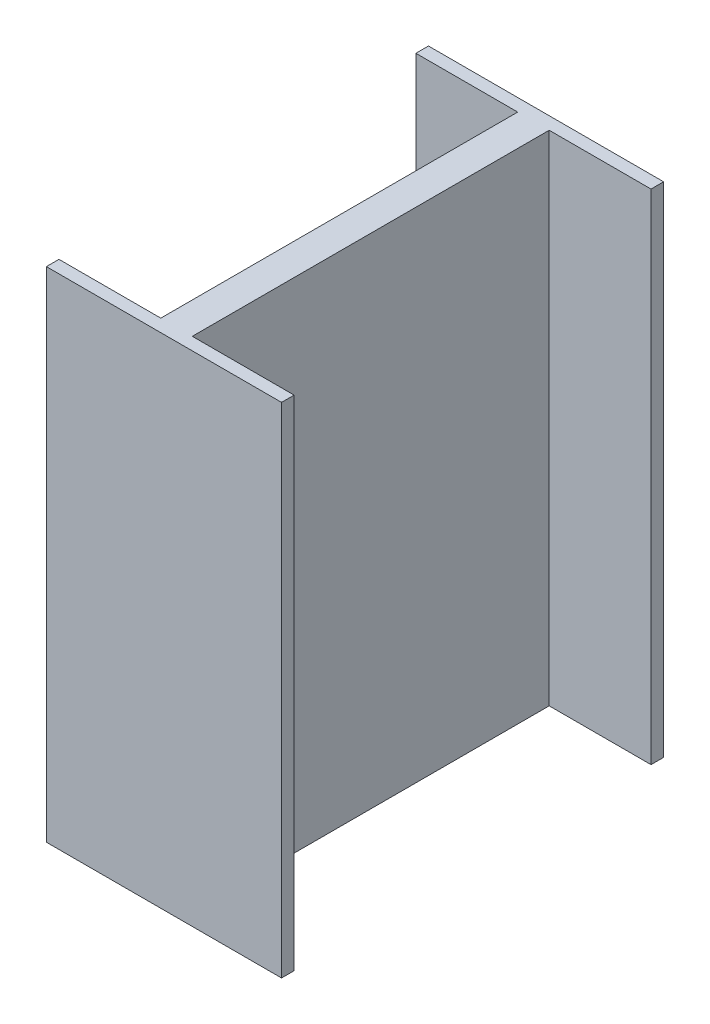
ISO-10303-21;
HEADER;
FILE_DESCRIPTION(('STEP AP214'),'2;1');
FILE_NAME('part.step','',(''),(''),'','','');
FILE_SCHEMA(('AUTOMOTIVE_DESIGN { 1 0 10303 214 1 1 1 1 }'));
ENDSEC;
DATA;
#1=APPLICATION_CONTEXT('core data for automotive mechanical design processes');
#2=APPLICATION_PROTOCOL_DEFINITION('international standard','automotive_design',2000,#1);
#3=PRODUCT_CONTEXT('',#1,'mechanical');
#4=PRODUCT('Part','Part','',(#3));
#5=PRODUCT_RELATED_PRODUCT_CATEGORY('part','',(#4));
#6=PRODUCT_DEFINITION_FORMATION('','',#4);
#7=PRODUCT_DEFINITION_CONTEXT('part definition',#1,'design');
#8=PRODUCT_DEFINITION('design','',#6,#7);
#9=PRODUCT_DEFINITION_SHAPE('','',#8);
#10=(LENGTH_UNIT() NAMED_UNIT(*) SI_UNIT(.MILLI.,.METRE.));
#11=(NAMED_UNIT(*) PLANE_ANGLE_UNIT() SI_UNIT($,.RADIAN.));
#12=(NAMED_UNIT(*) SI_UNIT($,.STERADIAN.) SOLID_ANGLE_UNIT());
#13=UNCERTAINTY_MEASURE_WITH_UNIT(LENGTH_MEASURE(1.E-05),#10,'distance_accuracy_value','');
#14=(GEOMETRIC_REPRESENTATION_CONTEXT(3) GLOBAL_UNCERTAINTY_ASSIGNED_CONTEXT((#13)) GLOBAL_UNIT_ASSIGNED_CONTEXT((#10,
#11,#12)) REPRESENTATION_CONTEXT('',''));
#15=CARTESIAN_POINT('',(0.,0.,0.));
#16=DIRECTION('',(0.,0.,1.));
#17=DIRECTION('',(1.,0.,0.));
#18=AXIS2_PLACEMENT_3D('',#15,#16,#17);
#19=CARTESIAN_POINT('',(-37.5,1187.25,-425.));
#20=DIRECTION('',(0.,0.,1.));
#21=DIRECTION('',(1.,0.,0.));
#22=AXIS2_PLACEMENT_3D('',#19,#20,#21);
#23=PLANE('',#22);
#24=DIRECTION('',(-1.,0.,0.));
#25=VECTOR('',#24,1.);
#26=CARTESIAN_POINT('',(-37.5,0.,-425.));
#27=LINE('',#26,#25);
#28=CARTESIAN_POINT('',(-37.5,0.,-425.));
#29=VERTEX_POINT('',#28);
#30=CARTESIAN_POINT('',(-280.014880556969,0.,-425.));
#31=VERTEX_POINT('',#30);
#32=EDGE_CURVE('E163',#29,#31,#27,.T.);
#33=ORIENTED_EDGE('',*,*,#32,.F.);
#34=DIRECTION('',(0.,-1.,0.));
#35=VECTOR('',#34,1.);
#36=CARTESIAN_POINT('',(-37.5,1187.25,-425.));
#37=LINE('',#36,#35);
#38=CARTESIAN_POINT('',(-37.5,1187.25,-425.));
#39=VERTEX_POINT('',#38);
#40=EDGE_CURVE('E11',#39,#29,#37,.T.);
#41=ORIENTED_EDGE('',*,*,#40,.F.);
#42=DIRECTION('',(-1.,0.,0.));
#43=VECTOR('',#42,1.);
#44=CARTESIAN_POINT('',(-37.5,1187.25,-425.));
#45=LINE('',#44,#43);
#46=CARTESIAN_POINT('',(-280.014880556969,1187.25,-425.));
#47=VERTEX_POINT('',#46);
#48=EDGE_CURVE('E193',#39,#47,#45,.T.);
#49=ORIENTED_EDGE('',*,*,#48,.T.);
#50=DIRECTION('',(0.,-1.,0.));
#51=VECTOR('',#50,1.);
#52=CARTESIAN_POINT('',(-280.014880556969,1187.25,-425.));
#53=LINE('',#52,#51);
#54=EDGE_CURVE('E45',#47,#31,#53,.T.);
#55=ORIENTED_EDGE('',*,*,#54,.T.);
#56=EDGE_LOOP('',(#33,#41,#49,#55));
#57=FACE_BOUND('',#56,.T.);
#58=ADVANCED_FACE('F42',(#57),#23,.T.);
#59=CARTESIAN_POINT('',(-37.5,1187.25,-425.));
#60=DIRECTION('',(1.,0.,0.));
#61=DIRECTION('',(0.,0.,-1.));
#62=AXIS2_PLACEMENT_3D('',#59,#60,#61);
#63=PLANE('',#62);
#64=DIRECTION('',(0.,0.,1.));
#65=VECTOR('',#64,1.);
#66=CARTESIAN_POINT('',(-37.5,0.,-425.));
#67=LINE('',#66,#65);
#68=CARTESIAN_POINT('',(-37.4999999999996,0.,425.));
#69=VERTEX_POINT('',#68);
#70=EDGE_CURVE('E99',#29,#69,#67,.T.);
#71=ORIENTED_EDGE('',*,*,#70,.T.);
#72=DIRECTION('',(0.,-1.,0.));
#73=VECTOR('',#72,1.);
#74=CARTESIAN_POINT('',(-37.4999999999996,1187.25,425.));
#75=LINE('',#74,#73);
#76=CARTESIAN_POINT('',(-37.4999999999996,1187.25,425.));
#77=VERTEX_POINT('',#76);
#78=EDGE_CURVE('E51',#77,#69,#75,.T.);
#79=ORIENTED_EDGE('',*,*,#78,.F.);
#80=DIRECTION('',(0.,0.,1.));
#81=VECTOR('',#80,1.);
#82=CARTESIAN_POINT('',(-37.5,1187.25,-425.));
#83=LINE('',#82,#81);
#84=EDGE_CURVE('E141',#39,#77,#83,.T.);
#85=ORIENTED_EDGE('',*,*,#84,.F.);
#86=ORIENTED_EDGE('',*,*,#40,.T.);
#87=EDGE_LOOP('',(#71,#79,#85,#86));
#88=FACE_BOUND('',#87,.T.);
#89=ADVANCED_FACE('F269',(#88),#63,.F.);
#90=CARTESIAN_POINT('',(-37.4999999999996,1187.25,425.));
#91=DIRECTION('',(0.,0.,1.));
#92=DIRECTION('',(1.,0.,0.));
#93=AXIS2_PLACEMENT_3D('',#90,#91,#92);
#94=PLANE('',#93);
#95=DIRECTION('',(-1.,0.,0.));
#96=VECTOR('',#95,1.);
#97=CARTESIAN_POINT('',(-37.4999999999996,0.,425.));
#98=LINE('',#97,#96);
#99=CARTESIAN_POINT('',(-280.014880556968,0.,425.));
#100=VERTEX_POINT('',#99);
#101=EDGE_CURVE('E148',#69,#100,#98,.T.);
#102=ORIENTED_EDGE('',*,*,#101,.T.);
#103=DIRECTION('',(0.,-1.,0.));
#104=VECTOR('',#103,1.);
#105=CARTESIAN_POINT('',(-280.014880556968,1187.25,425.));
#106=LINE('',#105,#104);
#107=CARTESIAN_POINT('',(-280.014880556968,1187.25,425.));
#108=VERTEX_POINT('',#107);
#109=EDGE_CURVE('E145',#108,#100,#106,.T.);
#110=ORIENTED_EDGE('',*,*,#109,.F.);
#111=DIRECTION('',(-1.,0.,0.));
#112=VECTOR('',#111,1.);
#113=CARTESIAN_POINT('',(-37.4999999999996,1187.25,425.));
#114=LINE('',#113,#112);
#115=EDGE_CURVE('E136',#77,#108,#114,.T.);
#116=ORIENTED_EDGE('',*,*,#115,.F.);
#117=ORIENTED_EDGE('',*,*,#78,.T.);
#118=EDGE_LOOP('',(#102,#110,#116,#117));
#119=FACE_BOUND('',#118,.T.);
#120=ADVANCED_FACE('F146',(#119),#94,.F.);
#121=CARTESIAN_POINT('',(-280.014880556966,1187.25,455.));
#122=DIRECTION('',(-1.,0.,0.));
#123=DIRECTION('',(0.,0.,1.));
#124=AXIS2_PLACEMENT_3D('',#121,#122,#123);
#125=PLANE('',#124);
#126=DIRECTION('',(0.,0.,-1.));
#127=VECTOR('',#126,1.);
#128=CARTESIAN_POINT('',(-280.014880556966,0.,455.));
#129=LINE('',#128,#127);
#130=CARTESIAN_POINT('',(-280.014880556966,0.,455.));
#131=VERTEX_POINT('',#130);
#132=EDGE_CURVE('E190',#131,#100,#129,.T.);
#133=ORIENTED_EDGE('',*,*,#132,.F.);
#134=DIRECTION('',(0.,-1.,0.));
#135=VECTOR('',#134,1.);
#136=CARTESIAN_POINT('',(-280.014880556966,1187.25,455.));
#137=LINE('',#136,#135);
#138=CARTESIAN_POINT('',(-280.014880556966,1187.25,455.));
#139=VERTEX_POINT('',#138);
#140=EDGE_CURVE('E152',#139,#131,#137,.T.);
#141=ORIENTED_EDGE('',*,*,#140,.F.);
#142=DIRECTION('',(0.,0.,-1.));
#143=VECTOR('',#142,1.);
#144=CARTESIAN_POINT('',(-280.014880556966,1187.25,455.));
#145=LINE('',#144,#143);
#146=EDGE_CURVE('E140',#139,#108,#145,.T.);
#147=ORIENTED_EDGE('',*,*,#146,.T.);
#148=ORIENTED_EDGE('',*,*,#109,.T.);
#149=EDGE_LOOP('',(#133,#141,#147,#148));
#150=FACE_BOUND('',#149,.T.);
#151=ADVANCED_FACE('F155',(#150),#125,.T.);
#152=CARTESIAN_POINT('',(-37.5,1187.25,455.));
#153=DIRECTION('',(0.,0.,1.));
#154=DIRECTION('',(1.,0.,0.));
#155=AXIS2_PLACEMENT_3D('',#152,#153,#154);
#156=PLANE('',#155);
#157=DIRECTION('',(-1.,0.,0.));
#158=VECTOR('',#157,1.);
#159=CARTESIAN_POINT('',(-37.5,0.,455.));
#160=LINE('',#159,#158);
#161=CARTESIAN_POINT('',(280.014880556966,0.,455.));
#162=VERTEX_POINT('',#161);
#163=EDGE_CURVE('E187',#162,#131,#160,.T.);
#164=ORIENTED_EDGE('',*,*,#163,.F.);
#165=DIRECTION('',(0.,-1.,0.));
#166=VECTOR('',#165,1.);
#167=CARTESIAN_POINT('',(280.014880556966,1187.25,455.));
#168=LINE('',#167,#166);
#169=CARTESIAN_POINT('',(280.014880556966,1187.25,455.));
#170=VERTEX_POINT('',#169);
#171=EDGE_CURVE('E197',#170,#162,#168,.T.);
#172=ORIENTED_EDGE('',*,*,#171,.F.);
#173=DIRECTION('',(1.,0.,0.));
#174=VECTOR('',#173,1.);
#175=CARTESIAN_POINT('',(37.5,1187.25,455.));
#176=LINE('',#175,#174);
#177=EDGE_CURVE('E156',#139,#170,#176,.T.);
#178=ORIENTED_EDGE('',*,*,#177,.F.);
#179=ORIENTED_EDGE('',*,*,#140,.T.);
#180=EDGE_LOOP('',(#164,#172,#178,#179));
#181=FACE_BOUND('',#180,.T.);
#182=ADVANCED_FACE('F220',(#181),#156,.T.);
#183=CARTESIAN_POINT('',(280.014880556966,1187.25,455.));
#184=DIRECTION('',(-1.,0.,0.));
#185=DIRECTION('',(0.,0.,1.));
#186=AXIS2_PLACEMENT_3D('',#183,#184,#185);
#187=PLANE('',#186);
#188=DIRECTION('',(0.,0.,-1.));
#189=VECTOR('',#188,1.);
#190=CARTESIAN_POINT('',(280.014880556966,0.,455.));
#191=LINE('',#190,#189);
#192=CARTESIAN_POINT('',(280.014880556968,0.,425.));
#193=VERTEX_POINT('',#192);
#194=EDGE_CURVE('E184',#162,#193,#191,.T.);
#195=ORIENTED_EDGE('',*,*,#194,.T.);
#196=DIRECTION('',(0.,-1.,0.));
#197=VECTOR('',#196,1.);
#198=CARTESIAN_POINT('',(280.014880556968,1187.25,425.));
#199=LINE('',#198,#197);
#200=CARTESIAN_POINT('',(280.014880556968,1187.25,425.));
#201=VERTEX_POINT('',#200);
#202=EDGE_CURVE('E200',#201,#193,#199,.T.);
#203=ORIENTED_EDGE('',*,*,#202,.F.);
#204=DIRECTION('',(0.,0.,-1.));
#205=VECTOR('',#204,1.);
#206=CARTESIAN_POINT('',(280.014880556966,1187.25,455.));
#207=LINE('',#206,#205);
#208=EDGE_CURVE('E158',#170,#201,#207,.T.);
#209=ORIENTED_EDGE('',*,*,#208,.F.);
#210=ORIENTED_EDGE('',*,*,#171,.T.);
#211=EDGE_LOOP('',(#195,#203,#209,#210));
#212=FACE_BOUND('',#211,.T.);
#213=ADVANCED_FACE('F223',(#212),#187,.F.);
#214=CARTESIAN_POINT('',(37.4999999999996,1187.25,425.));
#215=DIRECTION('',(0.,0.,-1.));
#216=DIRECTION('',(-1.,0.,0.));
#217=AXIS2_PLACEMENT_3D('',#214,#215,#216);
#218=PLANE('',#217);
#219=DIRECTION('',(1.,0.,0.));
#220=VECTOR('',#219,1.);
#221=CARTESIAN_POINT('',(37.4999999999996,0.,425.));
#222=LINE('',#221,#220);
#223=CARTESIAN_POINT('',(37.4999999999996,0.,425.));
#224=VERTEX_POINT('',#223);
#225=EDGE_CURVE('E181',#224,#193,#222,.T.);
#226=ORIENTED_EDGE('',*,*,#225,.F.);
#227=DIRECTION('',(0.,-1.,0.));
#228=VECTOR('',#227,1.);
#229=CARTESIAN_POINT('',(37.4999999999996,1187.25,425.));
#230=LINE('',#229,#228);
#231=CARTESIAN_POINT('',(37.4999999999996,1187.25,425.));
#232=VERTEX_POINT('',#231);
#233=EDGE_CURVE('E202',#232,#224,#230,.T.);
#234=ORIENTED_EDGE('',*,*,#233,.F.);
#235=DIRECTION('',(1.,0.,0.));
#236=VECTOR('',#235,1.);
#237=CARTESIAN_POINT('',(37.4999999999996,1187.25,425.));
#238=LINE('',#237,#236);
#239=EDGE_CURVE('E227',#232,#201,#238,.T.);
#240=ORIENTED_EDGE('',*,*,#239,.T.);
#241=ORIENTED_EDGE('',*,*,#202,.T.);
#242=EDGE_LOOP('',(#226,#234,#240,#241));
#243=FACE_BOUND('',#242,.T.);
#244=ADVANCED_FACE('F259',(#243),#218,.T.);
#245=CARTESIAN_POINT('',(37.5,1187.25,-425.));
#246=DIRECTION('',(1.,0.,0.));
#247=DIRECTION('',(0.,0.,-1.));
#248=AXIS2_PLACEMENT_3D('',#245,#246,#247);
#249=PLANE('',#248);
#250=DIRECTION('',(0.,0.,1.));
#251=VECTOR('',#250,1.);
#252=CARTESIAN_POINT('',(37.5,0.,-425.));
#253=LINE('',#252,#251);
#254=CARTESIAN_POINT('',(37.5,0.,-425.));
#255=VERTEX_POINT('',#254);
#256=EDGE_CURVE('E178',#255,#224,#253,.T.);
#257=ORIENTED_EDGE('',*,*,#256,.F.);
#258=DIRECTION('',(0.,-1.,0.));
#259=VECTOR('',#258,1.);
#260=CARTESIAN_POINT('',(37.5,1187.25,-425.));
#261=LINE('',#260,#259);
#262=CARTESIAN_POINT('',(37.5,1187.25,-425.));
#263=VERTEX_POINT('',#262);
#264=EDGE_CURVE('E204',#263,#255,#261,.T.);
#265=ORIENTED_EDGE('',*,*,#264,.F.);
#266=DIRECTION('',(0.,0.,1.));
#267=VECTOR('',#266,1.);
#268=CARTESIAN_POINT('',(37.5,1187.25,-425.));
#269=LINE('',#268,#267);
#270=EDGE_CURVE('E228',#263,#232,#269,.T.);
#271=ORIENTED_EDGE('',*,*,#270,.T.);
#272=ORIENTED_EDGE('',*,*,#233,.T.);
#273=EDGE_LOOP('',(#257,#265,#271,#272));
#274=FACE_BOUND('',#273,.T.);
#275=ADVANCED_FACE('F256',(#274),#249,.T.);
#276=CARTESIAN_POINT('',(37.5,1187.25,-425.));
#277=DIRECTION('',(0.,0.,-1.));
#278=DIRECTION('',(-1.,0.,0.));
#279=AXIS2_PLACEMENT_3D('',#276,#277,#278);
#280=PLANE('',#279);
#281=DIRECTION('',(1.,0.,0.));
#282=VECTOR('',#281,1.);
#283=CARTESIAN_POINT('',(37.5,0.,-425.));
#284=LINE('',#283,#282);
#285=CARTESIAN_POINT('',(280.014880556969,0.,-425.));
#286=VERTEX_POINT('',#285);
#287=EDGE_CURVE('E175',#255,#286,#284,.T.);
#288=ORIENTED_EDGE('',*,*,#287,.T.);
#289=DIRECTION('',(0.,-1.,0.));
#290=VECTOR('',#289,1.);
#291=CARTESIAN_POINT('',(280.014880556969,1187.25,-425.));
#292=LINE('',#291,#290);
#293=CARTESIAN_POINT('',(280.014880556969,1187.25,-425.));
#294=VERTEX_POINT('',#293);
#295=EDGE_CURVE('E206',#294,#286,#292,.T.);
#296=ORIENTED_EDGE('',*,*,#295,.F.);
#297=DIRECTION('',(1.,0.,0.));
#298=VECTOR('',#297,1.);
#299=CARTESIAN_POINT('',(37.5,1187.25,-425.));
#300=LINE('',#299,#298);
#301=EDGE_CURVE('E233',#263,#294,#300,.T.);
#302=ORIENTED_EDGE('',*,*,#301,.F.);
#303=ORIENTED_EDGE('',*,*,#264,.T.);
#304=EDGE_LOOP('',(#288,#296,#302,#303));
#305=FACE_BOUND('',#304,.T.);
#306=ADVANCED_FACE('F253',(#305),#280,.F.);
#307=CARTESIAN_POINT('',(280.014880556966,1187.25,-455.));
#308=DIRECTION('',(1.,0.,0.));
#309=DIRECTION('',(0.,0.,-1.));
#310=AXIS2_PLACEMENT_3D('',#307,#308,#309);
#311=PLANE('',#310);
#312=DIRECTION('',(0.,0.,1.));
#313=VECTOR('',#312,1.);
#314=CARTESIAN_POINT('',(280.014880556966,0.,-455.));
#315=LINE('',#314,#313);
#316=CARTESIAN_POINT('',(280.014880556966,0.,-455.));
#317=VERTEX_POINT('',#316);
#318=EDGE_CURVE('E172',#317,#286,#315,.T.);
#319=ORIENTED_EDGE('',*,*,#318,.F.);
#320=DIRECTION('',(0.,-1.,0.));
#321=VECTOR('',#320,1.);
#322=CARTESIAN_POINT('',(280.014880556966,1187.25,-455.));
#323=LINE('',#322,#321);
#324=CARTESIAN_POINT('',(280.014880556966,1187.25,-455.));
#325=VERTEX_POINT('',#324);
#326=EDGE_CURVE('E208',#325,#317,#323,.T.);
#327=ORIENTED_EDGE('',*,*,#326,.F.);
#328=DIRECTION('',(0.,0.,1.));
#329=VECTOR('',#328,1.);
#330=CARTESIAN_POINT('',(280.014880556966,1187.25,-455.));
#331=LINE('',#330,#329);
#332=EDGE_CURVE('E235',#325,#294,#331,.T.);
#333=ORIENTED_EDGE('',*,*,#332,.T.);
#334=ORIENTED_EDGE('',*,*,#295,.T.);
#335=EDGE_LOOP('',(#319,#327,#333,#334));
#336=FACE_BOUND('',#335,.T.);
#337=ADVANCED_FACE('F249',(#336),#311,.T.);
#338=CARTESIAN_POINT('',(37.5,1187.25,-455.));
#339=DIRECTION('',(0.,0.,-1.));
#340=DIRECTION('',(-1.,0.,0.));
#341=AXIS2_PLACEMENT_3D('',#338,#339,#340);
#342=PLANE('',#341);
#343=DIRECTION('',(1.,0.,0.));
#344=VECTOR('',#343,1.);
#345=CARTESIAN_POINT('',(37.5,0.,-455.));
#346=LINE('',#345,#344);
#347=CARTESIAN_POINT('',(-280.014880556966,0.,-455.));
#348=VERTEX_POINT('',#347);
#349=EDGE_CURVE('E169',#348,#317,#346,.T.);
#350=ORIENTED_EDGE('',*,*,#349,.F.);
#351=DIRECTION('',(0.,-1.,0.));
#352=VECTOR('',#351,1.);
#353=CARTESIAN_POINT('',(-280.014880556966,1187.25,-455.));
#354=LINE('',#353,#352);
#355=CARTESIAN_POINT('',(-280.014880556966,1187.25,-455.));
#356=VERTEX_POINT('',#355);
#357=EDGE_CURVE('E209',#356,#348,#354,.T.);
#358=ORIENTED_EDGE('',*,*,#357,.F.);
#359=DIRECTION('',(-1.,0.,0.));
#360=VECTOR('',#359,1.);
#361=CARTESIAN_POINT('',(-37.5,1187.25,-455.));
#362=LINE('',#361,#360);
#363=EDGE_CURVE('E238',#325,#356,#362,.T.);
#364=ORIENTED_EDGE('',*,*,#363,.F.);
#365=ORIENTED_EDGE('',*,*,#326,.T.);
#366=EDGE_LOOP('',(#350,#358,#364,#365));
#367=FACE_BOUND('',#366,.T.);
#368=ADVANCED_FACE('F244',(#367),#342,.T.);
#369=CARTESIAN_POINT('',(-280.014880556966,1187.25,-455.));
#370=DIRECTION('',(1.,0.,0.));
#371=DIRECTION('',(0.,0.,-1.));
#372=AXIS2_PLACEMENT_3D('',#369,#370,#371);
#373=PLANE('',#372);
#374=DIRECTION('',(0.,0.,1.));
#375=VECTOR('',#374,1.);
#376=CARTESIAN_POINT('',(-280.014880556966,0.,-455.));
#377=LINE('',#376,#375);
#378=EDGE_CURVE('E166',#348,#31,#377,.T.);
#379=ORIENTED_EDGE('',*,*,#378,.T.);
#380=ORIENTED_EDGE('',*,*,#54,.F.);
#381=DIRECTION('',(0.,0.,1.));
#382=VECTOR('',#381,1.);
#383=CARTESIAN_POINT('',(-280.014880556966,1187.25,-455.));
#384=LINE('',#383,#382);
#385=EDGE_CURVE('E109',#356,#47,#384,.T.);
#386=ORIENTED_EDGE('',*,*,#385,.F.);
#387=ORIENTED_EDGE('',*,*,#357,.T.);
#388=EDGE_LOOP('',(#379,#380,#386,#387));
#389=FACE_BOUND('',#388,.T.);
#390=ADVANCED_FACE('F214',(#389),#373,.F.);
#391=CARTESIAN_POINT('',(0.,1187.25,0.));
#392=DIRECTION('',(0.,1.,0.));
#393=DIRECTION('',(0.,0.,1.));
#394=AXIS2_PLACEMENT_3D('',#391,#392,#393);
#395=PLANE('',#394);
#396=ORIENTED_EDGE('',*,*,#48,.F.);
#397=ORIENTED_EDGE('',*,*,#84,.T.);
#398=ORIENTED_EDGE('',*,*,#115,.T.);
#399=ORIENTED_EDGE('',*,*,#146,.F.);
#400=ORIENTED_EDGE('',*,*,#177,.T.);
#401=ORIENTED_EDGE('',*,*,#208,.T.);
#402=ORIENTED_EDGE('',*,*,#239,.F.);
#403=ORIENTED_EDGE('',*,*,#270,.F.);
#404=ORIENTED_EDGE('',*,*,#301,.T.);
#405=ORIENTED_EDGE('',*,*,#332,.F.);
#406=ORIENTED_EDGE('',*,*,#363,.T.);
#407=ORIENTED_EDGE('',*,*,#385,.T.);
#408=EDGE_LOOP('',(#396,#397,#398,#399,#400,#401,#402,#403,#404,#405,#406,#407));
#409=FACE_BOUND('',#408,.T.);
#410=ADVANCED_FACE('F138',(#409),#395,.T.);
#411=CARTESIAN_POINT('',(0.,0.,0.));
#412=DIRECTION('',(0.,1.,0.));
#413=DIRECTION('',(0.,0.,1.));
#414=AXIS2_PLACEMENT_3D('',#411,#412,#413);
#415=PLANE('',#414);
#416=ORIENTED_EDGE('',*,*,#32,.T.);
#417=ORIENTED_EDGE('',*,*,#378,.F.);
#418=ORIENTED_EDGE('',*,*,#349,.T.);
#419=ORIENTED_EDGE('',*,*,#318,.T.);
#420=ORIENTED_EDGE('',*,*,#287,.F.);
#421=ORIENTED_EDGE('',*,*,#256,.T.);
#422=ORIENTED_EDGE('',*,*,#225,.T.);
#423=ORIENTED_EDGE('',*,*,#194,.F.);
#424=ORIENTED_EDGE('',*,*,#163,.T.);
#425=ORIENTED_EDGE('',*,*,#132,.T.);
#426=ORIENTED_EDGE('',*,*,#101,.F.);
#427=ORIENTED_EDGE('',*,*,#70,.F.);
#428=EDGE_LOOP('',(#416,#417,#418,#419,#420,#421,#422,#423,#424,#425,#426,#427));
#429=FACE_BOUND('',#428,.T.);
#430=ADVANCED_FACE('F216',(#429),#415,.F.);
#431=CLOSED_SHELL('',(#58,#89,#120,#151,#182,#213,#244,#275,#306,#337,#368,#390,#410,#430));
#432=MANIFOLD_SOLID_BREP('B2',#431);
#433=ADVANCED_BREP_SHAPE_REPRESENTATION('',(#18,#432),#14);
#434=SHAPE_DEFINITION_REPRESENTATION(#9,#433);
ENDSEC;
END-ISO-10303-21;
